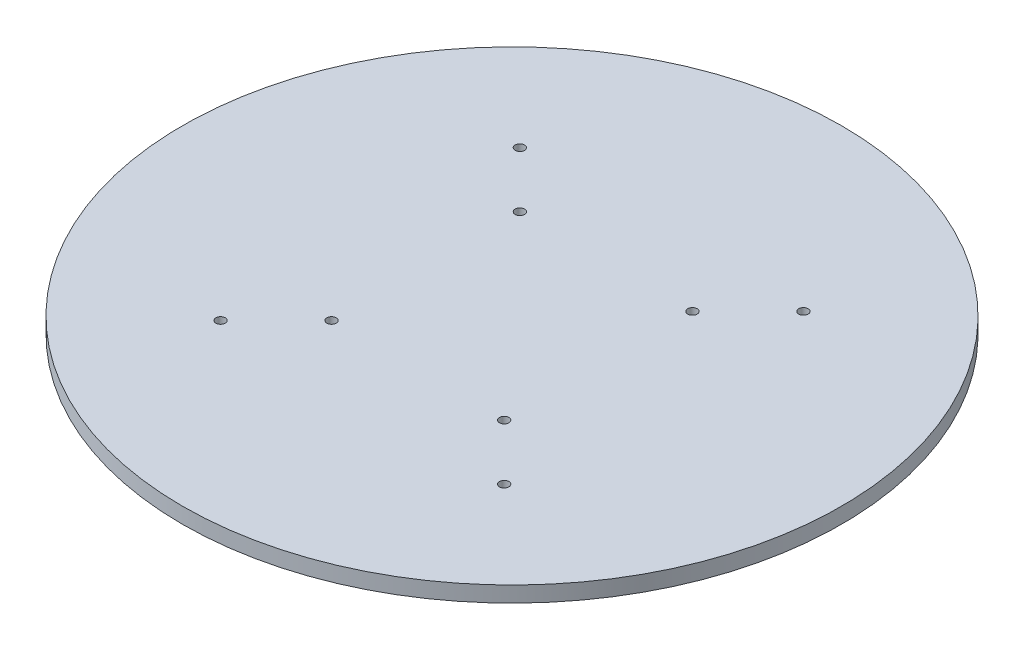
ISO-10303-21;
HEADER;
FILE_DESCRIPTION(('STEP AP214'),'2;1');
FILE_NAME('part.step','',(''),(''),'','','');
FILE_SCHEMA(('AUTOMOTIVE_DESIGN { 1 0 10303 214 1 1 1 1 }'));
ENDSEC;
DATA;
#1=APPLICATION_CONTEXT('core data for automotive mechanical design processes');
#2=APPLICATION_PROTOCOL_DEFINITION('international standard','automotive_design',2000,#1);
#3=PRODUCT_CONTEXT('',#1,'mechanical');
#4=PRODUCT('Part','Part','',(#3));
#5=PRODUCT_RELATED_PRODUCT_CATEGORY('part','',(#4));
#6=PRODUCT_DEFINITION_FORMATION('','',#4);
#7=PRODUCT_DEFINITION_CONTEXT('part definition',#1,'design');
#8=PRODUCT_DEFINITION('design','',#6,#7);
#9=PRODUCT_DEFINITION_SHAPE('','',#8);
#10=(LENGTH_UNIT() NAMED_UNIT(*) SI_UNIT(.MILLI.,.METRE.));
#11=(NAMED_UNIT(*) PLANE_ANGLE_UNIT() SI_UNIT($,.RADIAN.));
#12=(NAMED_UNIT(*) SI_UNIT($,.STERADIAN.) SOLID_ANGLE_UNIT());
#13=UNCERTAINTY_MEASURE_WITH_UNIT(LENGTH_MEASURE(1.E-05),#10,'distance_accuracy_value','');
#14=(GEOMETRIC_REPRESENTATION_CONTEXT(3) GLOBAL_UNCERTAINTY_ASSIGNED_CONTEXT((#13)) GLOBAL_UNIT_ASSIGNED_CONTEXT((#10,
#11,#12)) REPRESENTATION_CONTEXT('',''));
#15=CARTESIAN_POINT('',(0.,0.,0.));
#16=DIRECTION('',(0.,0.,1.));
#17=DIRECTION('',(1.,0.,0.));
#18=AXIS2_PLACEMENT_3D('',#15,#16,#17);
#19=CARTESIAN_POINT('',(0.,5.,0.));
#20=DIRECTION('',(0.,1.,0.));
#21=DIRECTION('',(0.,0.,1.));
#22=AXIS2_PLACEMENT_3D('',#19,#20,#21);
#23=PLANE('',#22);
#24=CARTESIAN_POINT('',(45.1776695296638,5.,47.6776695296636));
#25=DIRECTION('',(0.,1.,0.));
#26=DIRECTION('',(0.,0.,1.));
#27=AXIS2_PLACEMENT_3D('',#24,#25,#26);
#28=CIRCLE('',#27,1.5);
#29=CARTESIAN_POINT('',(45.1776695296638,5.,49.1776695296636));
#30=VERTEX_POINT('',#29);
#31=EDGE_CURVE('E100',#30,#30,#28,.T.);
#32=ORIENTED_EDGE('',*,*,#31,.F.);
#33=EDGE_LOOP('',(#32));
#34=FACE_BOUND('',#33,.T.);
#35=CARTESIAN_POINT('',(-45.1776695296638,5.,-47.6776695296636));
#36=DIRECTION('',(0.,1.,0.));
#37=DIRECTION('',(0.,0.,1.));
#38=AXIS2_PLACEMENT_3D('',#35,#36,#37);
#39=CIRCLE('',#38,1.5);
#40=CARTESIAN_POINT('',(-45.1776695296638,5.,-46.1776695296636));
#41=VERTEX_POINT('',#40);
#42=EDGE_CURVE('E84',#41,#41,#39,.T.);
#43=ORIENTED_EDGE('',*,*,#42,.F.);
#44=EDGE_LOOP('',(#43));
#45=FACE_BOUND('',#44,.T.);
#46=CARTESIAN_POINT('',(27.5,5.,30.));
#47=DIRECTION('',(0.,1.,0.));
#48=DIRECTION('',(0.,0.,1.));
#49=AXIS2_PLACEMENT_3D('',#46,#47,#48);
#50=CIRCLE('',#49,1.5);
#51=CARTESIAN_POINT('',(27.5,5.,31.5));
#52=VERTEX_POINT('',#51);
#53=EDGE_CURVE('E68',#52,#52,#50,.T.);
#54=ORIENTED_EDGE('',*,*,#53,.F.);
#55=EDGE_LOOP('',(#54));
#56=FACE_BOUND('',#55,.T.);
#57=CARTESIAN_POINT('',(-27.5,5.,-30.));
#58=DIRECTION('',(0.,1.,0.));
#59=DIRECTION('',(0.,0.,1.));
#60=AXIS2_PLACEMENT_3D('',#57,#58,#59);
#61=CIRCLE('',#60,1.5);
#62=CARTESIAN_POINT('',(-27.5,5.,-28.5));
#63=VERTEX_POINT('',#62);
#64=EDGE_CURVE('E54',#63,#63,#61,.T.);
#65=ORIENTED_EDGE('',*,*,#64,.F.);
#66=EDGE_LOOP('',(#65));
#67=FACE_BOUND('',#66,.T.);
#68=CARTESIAN_POINT('',(0.,5.,0.));
#69=DIRECTION('',(0.,1.,0.));
#70=DIRECTION('',(0.,0.,1.));
#71=AXIS2_PLACEMENT_3D('',#68,#69,#70);
#72=CIRCLE('',#71,105.);
#73=CARTESIAN_POINT('',(0.,5.,105.));
#74=VERTEX_POINT('',#73);
#75=EDGE_CURVE('E10',#74,#74,#72,.T.);
#76=ORIENTED_EDGE('',*,*,#75,.T.);
#77=EDGE_LOOP('',(#76));
#78=FACE_BOUND('',#77,.T.);
#79=CARTESIAN_POINT('',(27.5,5.,-30.));
#80=DIRECTION('',(0.,1.,0.));
#81=DIRECTION('',(0.,0.,-1.));
#82=AXIS2_PLACEMENT_3D('',#79,#80,#81);
#83=CIRCLE('',#82,1.5);
#84=CARTESIAN_POINT('',(27.5,5.,-31.5));
#85=VERTEX_POINT('',#84);
#86=EDGE_CURVE('E60',#85,#85,#83,.T.);
#87=ORIENTED_EDGE('',*,*,#86,.F.);
#88=EDGE_LOOP('',(#87));
#89=FACE_BOUND('',#88,.T.);
#90=CARTESIAN_POINT('',(-27.5,5.,30.));
#91=DIRECTION('',(0.,1.,0.));
#92=DIRECTION('',(0.,0.,-1.));
#93=AXIS2_PLACEMENT_3D('',#90,#91,#92);
#94=CIRCLE('',#93,1.5);
#95=CARTESIAN_POINT('',(-27.5,5.,28.5));
#96=VERTEX_POINT('',#95);
#97=EDGE_CURVE('E76',#96,#96,#94,.T.);
#98=ORIENTED_EDGE('',*,*,#97,.F.);
#99=EDGE_LOOP('',(#98));
#100=FACE_BOUND('',#99,.T.);
#101=CARTESIAN_POINT('',(45.1776695296638,5.,-47.6776695296636));
#102=DIRECTION('',(0.,1.,0.));
#103=DIRECTION('',(0.,0.,-1.));
#104=AXIS2_PLACEMENT_3D('',#101,#102,#103);
#105=CIRCLE('',#104,1.5);
#106=CARTESIAN_POINT('',(45.1776695296638,5.,-49.1776695296636));
#107=VERTEX_POINT('',#106);
#108=EDGE_CURVE('E92',#107,#107,#105,.T.);
#109=ORIENTED_EDGE('',*,*,#108,.F.);
#110=EDGE_LOOP('',(#109));
#111=FACE_BOUND('',#110,.T.);
#112=CARTESIAN_POINT('',(-45.1776695296638,5.,47.6776695296636));
#113=DIRECTION('',(0.,1.,0.));
#114=DIRECTION('',(0.,0.,-1.));
#115=AXIS2_PLACEMENT_3D('',#112,#113,#114);
#116=CIRCLE('',#115,1.5);
#117=CARTESIAN_POINT('',(-45.1776695296638,5.,46.1776695296636));
#118=VERTEX_POINT('',#117);
#119=EDGE_CURVE('E108',#118,#118,#116,.T.);
#120=ORIENTED_EDGE('',*,*,#119,.F.);
#121=EDGE_LOOP('',(#120));
#122=FACE_BOUND('',#121,.T.);
#123=ADVANCED_FACE('F41',(#34,#45,#56,#67,#78,#89,#100,#111,#122),#23,.T.);
#124=CARTESIAN_POINT('',(0.,0.,0.));
#125=DIRECTION('',(0.,1.,0.));
#126=DIRECTION('',(0.,0.,1.));
#127=AXIS2_PLACEMENT_3D('',#124,#125,#126);
#128=PLANE('',#127);
#129=CARTESIAN_POINT('',(0.,0.,0.));
#130=DIRECTION('',(0.,1.,0.));
#131=DIRECTION('',(0.,0.,1.));
#132=AXIS2_PLACEMENT_3D('',#129,#130,#131);
#133=CIRCLE('',#132,105.);
#134=CARTESIAN_POINT('',(0.,0.,105.));
#135=VERTEX_POINT('',#134);
#136=EDGE_CURVE('E45',#135,#135,#133,.T.);
#137=ORIENTED_EDGE('',*,*,#136,.F.);
#138=EDGE_LOOP('',(#137));
#139=FACE_BOUND('',#138,.T.);
#140=CARTESIAN_POINT('',(-27.5,0.,-30.));
#141=DIRECTION('',(0.,1.,0.));
#142=DIRECTION('',(0.,0.,1.));
#143=AXIS2_PLACEMENT_3D('',#140,#141,#142);
#144=CIRCLE('',#143,1.5);
#145=CARTESIAN_POINT('',(-27.5,0.,-28.5));
#146=VERTEX_POINT('',#145);
#147=EDGE_CURVE('E56',#146,#146,#144,.T.);
#148=ORIENTED_EDGE('',*,*,#147,.T.);
#149=EDGE_LOOP('',(#148));
#150=FACE_BOUND('',#149,.T.);
#151=CARTESIAN_POINT('',(27.5,0.,-30.));
#152=DIRECTION('',(0.,1.,0.));
#153=DIRECTION('',(0.,0.,-1.));
#154=AXIS2_PLACEMENT_3D('',#151,#152,#153);
#155=CIRCLE('',#154,1.5);
#156=CARTESIAN_POINT('',(27.5,0.,-31.5));
#157=VERTEX_POINT('',#156);
#158=EDGE_CURVE('E64',#157,#157,#155,.T.);
#159=ORIENTED_EDGE('',*,*,#158,.T.);
#160=EDGE_LOOP('',(#159));
#161=FACE_BOUND('',#160,.T.);
#162=CARTESIAN_POINT('',(27.5,0.,30.));
#163=DIRECTION('',(0.,1.,0.));
#164=DIRECTION('',(0.,0.,1.));
#165=AXIS2_PLACEMENT_3D('',#162,#163,#164);
#166=CIRCLE('',#165,1.5);
#167=CARTESIAN_POINT('',(27.5,0.,31.5));
#168=VERTEX_POINT('',#167);
#169=EDGE_CURVE('E72',#168,#168,#166,.T.);
#170=ORIENTED_EDGE('',*,*,#169,.T.);
#171=EDGE_LOOP('',(#170));
#172=FACE_BOUND('',#171,.T.);
#173=CARTESIAN_POINT('',(-27.5,0.,30.));
#174=DIRECTION('',(0.,1.,0.));
#175=DIRECTION('',(0.,0.,-1.));
#176=AXIS2_PLACEMENT_3D('',#173,#174,#175);
#177=CIRCLE('',#176,1.5);
#178=CARTESIAN_POINT('',(-27.5,0.,28.5));
#179=VERTEX_POINT('',#178);
#180=EDGE_CURVE('E80',#179,#179,#177,.T.);
#181=ORIENTED_EDGE('',*,*,#180,.T.);
#182=EDGE_LOOP('',(#181));
#183=FACE_BOUND('',#182,.T.);
#184=CARTESIAN_POINT('',(-45.1776695296638,0.,-47.6776695296636));
#185=DIRECTION('',(0.,1.,0.));
#186=DIRECTION('',(0.,0.,1.));
#187=AXIS2_PLACEMENT_3D('',#184,#185,#186);
#188=CIRCLE('',#187,1.5);
#189=CARTESIAN_POINT('',(-45.1776695296638,0.,-46.1776695296636));
#190=VERTEX_POINT('',#189);
#191=EDGE_CURVE('E88',#190,#190,#188,.T.);
#192=ORIENTED_EDGE('',*,*,#191,.T.);
#193=EDGE_LOOP('',(#192));
#194=FACE_BOUND('',#193,.T.);
#195=CARTESIAN_POINT('',(45.1776695296638,0.,-47.6776695296636));
#196=DIRECTION('',(0.,1.,0.));
#197=DIRECTION('',(0.,0.,-1.));
#198=AXIS2_PLACEMENT_3D('',#195,#196,#197);
#199=CIRCLE('',#198,1.5);
#200=CARTESIAN_POINT('',(45.1776695296638,0.,-49.1776695296636));
#201=VERTEX_POINT('',#200);
#202=EDGE_CURVE('E96',#201,#201,#199,.T.);
#203=ORIENTED_EDGE('',*,*,#202,.T.);
#204=EDGE_LOOP('',(#203));
#205=FACE_BOUND('',#204,.T.);
#206=CARTESIAN_POINT('',(45.1776695296638,0.,47.6776695296636));
#207=DIRECTION('',(0.,1.,0.));
#208=DIRECTION('',(0.,0.,1.));
#209=AXIS2_PLACEMENT_3D('',#206,#207,#208);
#210=CIRCLE('',#209,1.5);
#211=CARTESIAN_POINT('',(45.1776695296638,0.,49.1776695296636));
#212=VERTEX_POINT('',#211);
#213=EDGE_CURVE('E104',#212,#212,#210,.T.);
#214=ORIENTED_EDGE('',*,*,#213,.T.);
#215=EDGE_LOOP('',(#214));
#216=FACE_BOUND('',#215,.T.);
#217=CARTESIAN_POINT('',(-45.1776695296638,0.,47.6776695296636));
#218=DIRECTION('',(0.,1.,0.));
#219=DIRECTION('',(0.,0.,-1.));
#220=AXIS2_PLACEMENT_3D('',#217,#218,#219);
#221=CIRCLE('',#220,1.5);
#222=CARTESIAN_POINT('',(-45.1776695296638,0.,46.1776695296636));
#223=VERTEX_POINT('',#222);
#224=EDGE_CURVE('E112',#223,#223,#221,.T.);
#225=ORIENTED_EDGE('',*,*,#224,.T.);
#226=EDGE_LOOP('',(#225));
#227=FACE_BOUND('',#226,.T.);
#228=ADVANCED_FACE('F124',(#139,#150,#161,#172,#183,#194,#205,#216,#227),#128,.F.);
#229=CARTESIAN_POINT('',(0.,5.,0.));
#230=DIRECTION('',(0.,-1.,0.));
#231=DIRECTION('',(0.,0.,-1.));
#232=AXIS2_PLACEMENT_3D('',#229,#230,#231);
#233=CYLINDRICAL_SURFACE('',#232,105.);
#234=ORIENTED_EDGE('',*,*,#75,.F.);
#235=EDGE_LOOP('',(#234));
#236=FACE_BOUND('',#235,.T.);
#237=ORIENTED_EDGE('',*,*,#136,.T.);
#238=EDGE_LOOP('',(#237));
#239=FACE_BOUND('',#238,.T.);
#240=ADVANCED_FACE('F43',(#236,#239),#233,.T.);
#241=CARTESIAN_POINT('',(-27.5,5.,-30.));
#242=DIRECTION('',(0.,-1.,0.));
#243=DIRECTION('',(0.,0.,-1.));
#244=AXIS2_PLACEMENT_3D('',#241,#242,#243);
#245=CYLINDRICAL_SURFACE('',#244,1.5);
#246=ORIENTED_EDGE('',*,*,#64,.T.);
#247=EDGE_LOOP('',(#246));
#248=FACE_BOUND('',#247,.T.);
#249=ORIENTED_EDGE('',*,*,#147,.F.);
#250=EDGE_LOOP('',(#249));
#251=FACE_BOUND('',#250,.T.);
#252=ADVANCED_FACE('F134',(#248,#251),#245,.F.);
#253=CARTESIAN_POINT('',(27.5,5.,-30.));
#254=DIRECTION('',(0.,-1.,0.));
#255=DIRECTION('',(0.,0.,-1.));
#256=AXIS2_PLACEMENT_3D('',#253,#254,#255);
#257=CYLINDRICAL_SURFACE('',#256,1.5);
#258=ORIENTED_EDGE('',*,*,#86,.T.);
#259=EDGE_LOOP('',(#258));
#260=FACE_BOUND('',#259,.T.);
#261=ORIENTED_EDGE('',*,*,#158,.F.);
#262=EDGE_LOOP('',(#261));
#263=FACE_BOUND('',#262,.T.);
#264=ADVANCED_FACE('F137',(#260,#263),#257,.F.);
#265=CARTESIAN_POINT('',(27.5,5.,30.));
#266=DIRECTION('',(0.,-1.,0.));
#267=DIRECTION('',(0.,0.,-1.));
#268=AXIS2_PLACEMENT_3D('',#265,#266,#267);
#269=CYLINDRICAL_SURFACE('',#268,1.5);
#270=ORIENTED_EDGE('',*,*,#53,.T.);
#271=EDGE_LOOP('',(#270));
#272=FACE_BOUND('',#271,.T.);
#273=ORIENTED_EDGE('',*,*,#169,.F.);
#274=EDGE_LOOP('',(#273));
#275=FACE_BOUND('',#274,.T.);
#276=ADVANCED_FACE('F141',(#272,#275),#269,.F.);
#277=CARTESIAN_POINT('',(-27.5,5.,30.));
#278=DIRECTION('',(0.,-1.,0.));
#279=DIRECTION('',(0.,0.,-1.));
#280=AXIS2_PLACEMENT_3D('',#277,#278,#279);
#281=CYLINDRICAL_SURFACE('',#280,1.5);
#282=ORIENTED_EDGE('',*,*,#97,.T.);
#283=EDGE_LOOP('',(#282));
#284=FACE_BOUND('',#283,.T.);
#285=ORIENTED_EDGE('',*,*,#180,.F.);
#286=EDGE_LOOP('',(#285));
#287=FACE_BOUND('',#286,.T.);
#288=ADVANCED_FACE('F145',(#284,#287),#281,.F.);
#289=CARTESIAN_POINT('',(-45.1776695296638,5.,-47.6776695296636));
#290=DIRECTION('',(0.,-1.,0.));
#291=DIRECTION('',(0.,0.,-1.));
#292=AXIS2_PLACEMENT_3D('',#289,#290,#291);
#293=CYLINDRICAL_SURFACE('',#292,1.5);
#294=ORIENTED_EDGE('',*,*,#42,.T.);
#295=EDGE_LOOP('',(#294));
#296=FACE_BOUND('',#295,.T.);
#297=ORIENTED_EDGE('',*,*,#191,.F.);
#298=EDGE_LOOP('',(#297));
#299=FACE_BOUND('',#298,.T.);
#300=ADVANCED_FACE('F149',(#296,#299),#293,.F.);
#301=CARTESIAN_POINT('',(45.1776695296638,5.,-47.6776695296636));
#302=DIRECTION('',(0.,-1.,0.));
#303=DIRECTION('',(0.,0.,-1.));
#304=AXIS2_PLACEMENT_3D('',#301,#302,#303);
#305=CYLINDRICAL_SURFACE('',#304,1.5);
#306=ORIENTED_EDGE('',*,*,#108,.T.);
#307=EDGE_LOOP('',(#306));
#308=FACE_BOUND('',#307,.T.);
#309=ORIENTED_EDGE('',*,*,#202,.F.);
#310=EDGE_LOOP('',(#309));
#311=FACE_BOUND('',#310,.T.);
#312=ADVANCED_FACE('F153',(#308,#311),#305,.F.);
#313=CARTESIAN_POINT('',(45.1776695296638,5.,47.6776695296636));
#314=DIRECTION('',(0.,-1.,0.));
#315=DIRECTION('',(0.,0.,-1.));
#316=AXIS2_PLACEMENT_3D('',#313,#314,#315);
#317=CYLINDRICAL_SURFACE('',#316,1.5);
#318=ORIENTED_EDGE('',*,*,#31,.T.);
#319=EDGE_LOOP('',(#318));
#320=FACE_BOUND('',#319,.T.);
#321=ORIENTED_EDGE('',*,*,#213,.F.);
#322=EDGE_LOOP('',(#321));
#323=FACE_BOUND('',#322,.T.);
#324=ADVANCED_FACE('F157',(#320,#323),#317,.F.);
#325=CARTESIAN_POINT('',(-45.1776695296638,5.,47.6776695296636));
#326=DIRECTION('',(0.,-1.,0.));
#327=DIRECTION('',(0.,0.,-1.));
#328=AXIS2_PLACEMENT_3D('',#325,#326,#327);
#329=CYLINDRICAL_SURFACE('',#328,1.5);
#330=ORIENTED_EDGE('',*,*,#119,.T.);
#331=EDGE_LOOP('',(#330));
#332=FACE_BOUND('',#331,.T.);
#333=ORIENTED_EDGE('',*,*,#224,.F.);
#334=EDGE_LOOP('',(#333));
#335=FACE_BOUND('',#334,.T.);
#336=ADVANCED_FACE('F120',(#332,#335),#329,.F.);
#337=CLOSED_SHELL('',(#123,#228,#240,#252,#264,#276,#288,#300,#312,#324,#336));
#338=MANIFOLD_SOLID_BREP('B2',#337);
#339=ADVANCED_BREP_SHAPE_REPRESENTATION('',(#18,#338),#14);
#340=SHAPE_DEFINITION_REPRESENTATION(#9,#339);
ENDSEC;
END-ISO-10303-21;
